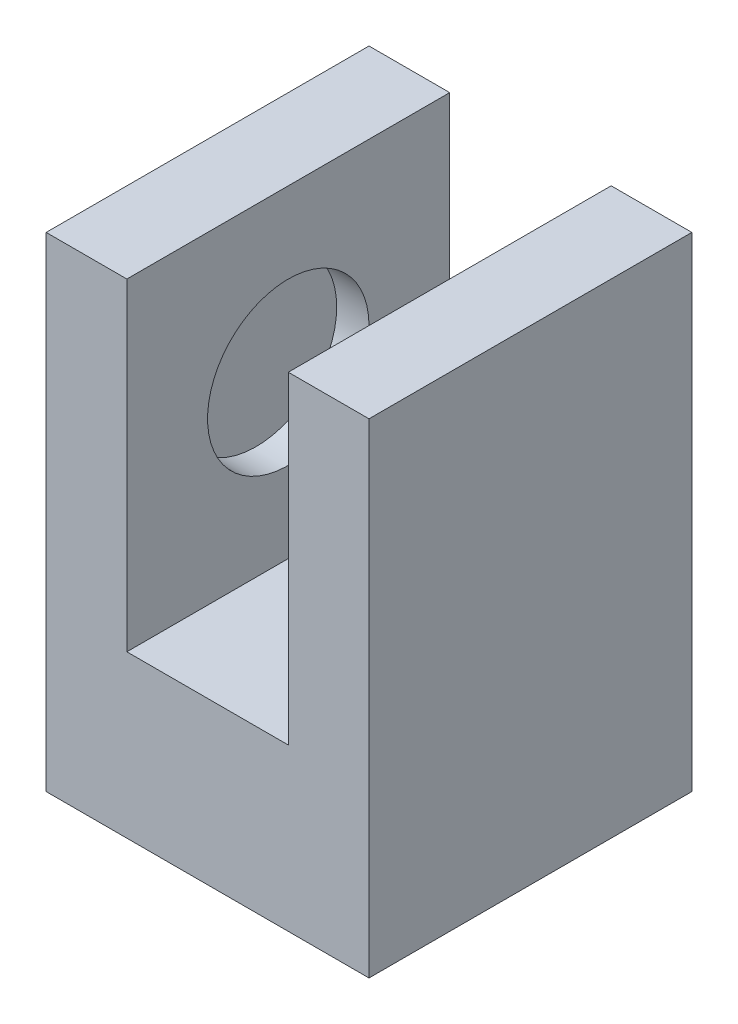
ISO-10303-21;
HEADER;
FILE_DESCRIPTION(('STEP AP214'),'2;1');
FILE_NAME('part.step','',(''),(''),'','','');
FILE_SCHEMA(('AUTOMOTIVE_DESIGN { 1 0 10303 214 1 1 1 1 }'));
ENDSEC;
DATA;
#1=APPLICATION_CONTEXT('core data for automotive mechanical design processes');
#2=APPLICATION_PROTOCOL_DEFINITION('international standard','automotive_design',2000,#1);
#3=PRODUCT_CONTEXT('',#1,'mechanical');
#4=PRODUCT('Part','Part','',(#3));
#5=PRODUCT_RELATED_PRODUCT_CATEGORY('part','',(#4));
#6=PRODUCT_DEFINITION_FORMATION('','',#4);
#7=PRODUCT_DEFINITION_CONTEXT('part definition',#1,'design');
#8=PRODUCT_DEFINITION('design','',#6,#7);
#9=PRODUCT_DEFINITION_SHAPE('','',#8);
#10=(LENGTH_UNIT() NAMED_UNIT(*) SI_UNIT(.MILLI.,.METRE.));
#11=(NAMED_UNIT(*) PLANE_ANGLE_UNIT() SI_UNIT($,.RADIAN.));
#12=(NAMED_UNIT(*) SI_UNIT($,.STERADIAN.) SOLID_ANGLE_UNIT());
#13=UNCERTAINTY_MEASURE_WITH_UNIT(LENGTH_MEASURE(1.E-05),#10,'distance_accuracy_value','');
#14=(GEOMETRIC_REPRESENTATION_CONTEXT(3) GLOBAL_UNCERTAINTY_ASSIGNED_CONTEXT((#13)) GLOBAL_UNIT_ASSIGNED_CONTEXT((#10,
#11,#12)) REPRESENTATION_CONTEXT('',''));
#15=CARTESIAN_POINT('',(0.,0.,0.));
#16=DIRECTION('',(0.,0.,1.));
#17=DIRECTION('',(1.,0.,0.));
#18=AXIS2_PLACEMENT_3D('',#15,#16,#17);
#19=CARTESIAN_POINT('',(0.,50.,0.));
#20=DIRECTION('',(0.,-1.,0.));
#21=DIRECTION('',(0.,0.,-1.));
#22=AXIS2_PLACEMENT_3D('',#19,#20,#21);
#23=PLANE('',#22);
#24=DIRECTION('',(-1.,0.,0.));
#25=VECTOR('',#24,1.);
#26=CARTESIAN_POINT('',(-50.,50.,-50.));
#27=LINE('',#26,#25);
#28=CARTESIAN_POINT('',(50.,50.,-50.));
#29=VERTEX_POINT('',#28);
#30=CARTESIAN_POINT('',(25.,50.,-50.));
#31=VERTEX_POINT('',#30);
#32=EDGE_CURVE('E139',#29,#31,#27,.T.);
#33=ORIENTED_EDGE('',*,*,#32,.T.);
#34=DIRECTION('',(0.,0.,-1.));
#35=VECTOR('',#34,1.);
#36=CARTESIAN_POINT('',(25.,50.,50.));
#37=LINE('',#36,#35);
#38=CARTESIAN_POINT('',(25.,50.,50.));
#39=VERTEX_POINT('',#38);
#40=EDGE_CURVE('E123',#39,#31,#37,.T.);
#41=ORIENTED_EDGE('',*,*,#40,.F.);
#42=DIRECTION('',(1.,0.,0.));
#43=VECTOR('',#42,1.);
#44=CARTESIAN_POINT('',(-50.,50.,50.));
#45=LINE('',#44,#43);
#46=CARTESIAN_POINT('',(50.,50.,50.));
#47=VERTEX_POINT('',#46);
#48=EDGE_CURVE('E145',#39,#47,#45,.T.);
#49=ORIENTED_EDGE('',*,*,#48,.T.);
#50=DIRECTION('',(0.,0.,-1.));
#51=VECTOR('',#50,1.);
#52=CARTESIAN_POINT('',(50.,50.,50.));
#53=LINE('',#52,#51);
#54=EDGE_CURVE('E135',#47,#29,#53,.T.);
#55=ORIENTED_EDGE('',*,*,#54,.T.);
#56=EDGE_LOOP('',(#33,#41,#49,#55));
#57=FACE_BOUND('',#56,.T.);
#58=ADVANCED_FACE('F41',(#57),#23,.F.);
#59=CARTESIAN_POINT('',(50.,-100.,50.));
#60=DIRECTION('',(1.,0.,0.));
#61=DIRECTION('',(0.,0.,-1.));
#62=AXIS2_PLACEMENT_3D('',#59,#60,#61);
#63=PLANE('',#62);
#64=DIRECTION('',(0.,1.,0.));
#65=VECTOR('',#64,1.);
#66=CARTESIAN_POINT('',(50.,-100.,-50.));
#67=LINE('',#66,#65);
#68=CARTESIAN_POINT('',(50.,-100.,-50.));
#69=VERTEX_POINT('',#68);
#70=EDGE_CURVE('E45',#69,#29,#67,.T.);
#71=ORIENTED_EDGE('',*,*,#70,.T.);
#72=ORIENTED_EDGE('',*,*,#54,.F.);
#73=DIRECTION('',(0.,1.,0.));
#74=VECTOR('',#73,1.);
#75=CARTESIAN_POINT('',(50.,-100.,50.));
#76=LINE('',#75,#74);
#77=CARTESIAN_POINT('',(50.,-100.,50.));
#78=VERTEX_POINT('',#77);
#79=EDGE_CURVE('E11',#78,#47,#76,.T.);
#80=ORIENTED_EDGE('',*,*,#79,.F.);
#81=DIRECTION('',(0.,0.,-1.));
#82=VECTOR('',#81,1.);
#83=CARTESIAN_POINT('',(50.,-100.,50.));
#84=LINE('',#83,#82);
#85=EDGE_CURVE('E149',#78,#69,#84,.T.);
#86=ORIENTED_EDGE('',*,*,#85,.T.);
#87=EDGE_LOOP('',(#71,#72,#80,#86));
#88=FACE_BOUND('',#87,.T.);
#89=ADVANCED_FACE('F43',(#88),#63,.T.);
#90=CARTESIAN_POINT('',(-50.,-100.,50.));
#91=DIRECTION('',(0.,0.,1.));
#92=DIRECTION('',(1.,0.,0.));
#93=AXIS2_PLACEMENT_3D('',#90,#91,#92);
#94=PLANE('',#93);
#95=DIRECTION('',(0.,1.,0.));
#96=VECTOR('',#95,1.);
#97=CARTESIAN_POINT('',(25.,-50.,50.));
#98=LINE('',#97,#96);
#99=CARTESIAN_POINT('',(25.,-50.,50.));
#100=VERTEX_POINT('',#99);
#101=EDGE_CURVE('E130',#100,#39,#98,.T.);
#102=ORIENTED_EDGE('',*,*,#101,.F.);
#103=DIRECTION('',(1.,0.,0.));
#104=VECTOR('',#103,1.);
#105=CARTESIAN_POINT('',(-25.,-50.,50.));
#106=LINE('',#105,#104);
#107=CARTESIAN_POINT('',(-25.,-50.,50.));
#108=VERTEX_POINT('',#107);
#109=EDGE_CURVE('E113',#108,#100,#106,.T.);
#110=ORIENTED_EDGE('',*,*,#109,.F.);
#111=DIRECTION('',(0.,1.,0.));
#112=VECTOR('',#111,1.);
#113=CARTESIAN_POINT('',(-25.,-50.,50.));
#114=LINE('',#113,#112);
#115=CARTESIAN_POINT('',(-25.,50.,50.));
#116=VERTEX_POINT('',#115);
#117=EDGE_CURVE('E110',#108,#116,#114,.T.);
#118=ORIENTED_EDGE('',*,*,#117,.T.);
#119=CARTESIAN_POINT('',(-50.,50.,50.));
#120=VERTEX_POINT('',#119);
#121=EDGE_CURVE('E146',#120,#116,#45,.T.);
#122=ORIENTED_EDGE('',*,*,#121,.F.);
#123=DIRECTION('',(0.,1.,0.));
#124=VECTOR('',#123,1.);
#125=CARTESIAN_POINT('',(-50.,-100.,50.));
#126=LINE('',#125,#124);
#127=CARTESIAN_POINT('',(-50.,-100.,50.));
#128=VERTEX_POINT('',#127);
#129=EDGE_CURVE('E50',#128,#120,#126,.T.);
#130=ORIENTED_EDGE('',*,*,#129,.F.);
#131=DIRECTION('',(1.,0.,0.));
#132=VECTOR('',#131,1.);
#133=CARTESIAN_POINT('',(-50.,-100.,50.));
#134=LINE('',#133,#132);
#135=EDGE_CURVE('E157',#128,#78,#134,.T.);
#136=ORIENTED_EDGE('',*,*,#135,.T.);
#137=ORIENTED_EDGE('',*,*,#79,.T.);
#138=ORIENTED_EDGE('',*,*,#48,.F.);
#139=EDGE_LOOP('',(#102,#110,#118,#122,#130,#136,#137,#138));
#140=FACE_BOUND('',#139,.T.);
#141=ADVANCED_FACE('F169',(#140),#94,.T.);
#142=CARTESIAN_POINT('',(-50.,-100.,50.));
#143=DIRECTION('',(-1.,0.,0.));
#144=DIRECTION('',(0.,0.,1.));
#145=AXIS2_PLACEMENT_3D('',#142,#143,#144);
#146=PLANE('',#145);
#147=ORIENTED_EDGE('',*,*,#129,.T.);
#148=DIRECTION('',(0.,0.,1.));
#149=VECTOR('',#148,1.);
#150=CARTESIAN_POINT('',(-50.,50.,50.));
#151=LINE('',#150,#149);
#152=CARTESIAN_POINT('',(-50.,50.,-50.));
#153=VERTEX_POINT('',#152);
#154=EDGE_CURVE('E142',#153,#120,#151,.T.);
#155=ORIENTED_EDGE('',*,*,#154,.F.);
#156=DIRECTION('',(0.,1.,0.));
#157=VECTOR('',#156,1.);
#158=CARTESIAN_POINT('',(-50.,-100.,-50.));
#159=LINE('',#158,#157);
#160=CARTESIAN_POINT('',(-50.,-100.,-50.));
#161=VERTEX_POINT('',#160);
#162=EDGE_CURVE('E160',#161,#153,#159,.T.);
#163=ORIENTED_EDGE('',*,*,#162,.F.);
#164=DIRECTION('',(0.,0.,1.));
#165=VECTOR('',#164,1.);
#166=CARTESIAN_POINT('',(-50.,-100.,50.));
#167=LINE('',#166,#165);
#168=EDGE_CURVE('E154',#161,#128,#167,.T.);
#169=ORIENTED_EDGE('',*,*,#168,.T.);
#170=EDGE_LOOP('',(#147,#155,#163,#169));
#171=FACE_BOUND('',#170,.T.);
#172=ADVANCED_FACE('F176',(#171),#146,.T.);
#173=CARTESIAN_POINT('',(-50.,-100.,-50.));
#174=DIRECTION('',(0.,0.,-1.));
#175=DIRECTION('',(-1.,0.,0.));
#176=AXIS2_PLACEMENT_3D('',#173,#174,#175);
#177=PLANE('',#176);
#178=DIRECTION('',(0.,1.,0.));
#179=VECTOR('',#178,1.);
#180=CARTESIAN_POINT('',(25.,-50.,-50.));
#181=LINE('',#180,#179);
#182=CARTESIAN_POINT('',(25.,-50.,-50.));
#183=VERTEX_POINT('',#182);
#184=EDGE_CURVE('E138',#183,#31,#181,.T.);
#185=ORIENTED_EDGE('',*,*,#184,.T.);
#186=ORIENTED_EDGE('',*,*,#32,.F.);
#187=ORIENTED_EDGE('',*,*,#70,.F.);
#188=DIRECTION('',(-1.,0.,0.));
#189=VECTOR('',#188,1.);
#190=CARTESIAN_POINT('',(-50.,-100.,-50.));
#191=LINE('',#190,#189);
#192=EDGE_CURVE('E151',#69,#161,#191,.T.);
#193=ORIENTED_EDGE('',*,*,#192,.T.);
#194=ORIENTED_EDGE('',*,*,#162,.T.);
#195=CARTESIAN_POINT('',(-25.,50.,-50.));
#196=VERTEX_POINT('',#195);
#197=EDGE_CURVE('E128',#196,#153,#27,.T.);
#198=ORIENTED_EDGE('',*,*,#197,.F.);
#199=DIRECTION('',(0.,1.,0.));
#200=VECTOR('',#199,1.);
#201=CARTESIAN_POINT('',(-25.,-50.,-50.));
#202=LINE('',#201,#200);
#203=CARTESIAN_POINT('',(-25.,-50.,-50.));
#204=VERTEX_POINT('',#203);
#205=EDGE_CURVE('E58',#204,#196,#202,.T.);
#206=ORIENTED_EDGE('',*,*,#205,.F.);
#207=DIRECTION('',(-1.,0.,0.));
#208=VECTOR('',#207,1.);
#209=CARTESIAN_POINT('',(25.,-50.,-50.));
#210=LINE('',#209,#208);
#211=EDGE_CURVE('E114',#183,#204,#210,.T.);
#212=ORIENTED_EDGE('',*,*,#211,.F.);
#213=EDGE_LOOP('',(#185,#186,#187,#193,#194,#198,#206,#212));
#214=FACE_BOUND('',#213,.T.);
#215=ADVANCED_FACE('F126',(#214),#177,.T.);
#216=CARTESIAN_POINT('',(0.,-100.,0.));
#217=DIRECTION('',(0.,-1.,0.));
#218=DIRECTION('',(0.,0.,-1.));
#219=AXIS2_PLACEMENT_3D('',#216,#217,#218);
#220=PLANE('',#219);
#221=ORIENTED_EDGE('',*,*,#85,.F.);
#222=ORIENTED_EDGE('',*,*,#135,.F.);
#223=ORIENTED_EDGE('',*,*,#168,.F.);
#224=ORIENTED_EDGE('',*,*,#192,.F.);
#225=EDGE_LOOP('',(#221,#222,#223,#224));
#226=FACE_BOUND('',#225,.T.);
#227=ADVANCED_FACE('F174',(#226),#220,.T.);
#228=ORIENTED_EDGE('',*,*,#121,.T.);
#229=DIRECTION('',(0.,0.,1.));
#230=VECTOR('',#229,1.);
#231=CARTESIAN_POINT('',(-25.,50.,-50.));
#232=LINE('',#231,#230);
#233=EDGE_CURVE('E181',#196,#116,#232,.T.);
#234=ORIENTED_EDGE('',*,*,#233,.F.);
#235=ORIENTED_EDGE('',*,*,#197,.T.);
#236=ORIENTED_EDGE('',*,*,#154,.T.);
#237=EDGE_LOOP('',(#228,#234,#235,#236));
#238=FACE_BOUND('',#237,.T.);
#239=ADVANCED_FACE('F178',(#238),#23,.F.);
#240=CARTESIAN_POINT('',(25.,-50.,50.));
#241=DIRECTION('',(1.,0.,0.));
#242=DIRECTION('',(0.,0.,-1.));
#243=AXIS2_PLACEMENT_3D('',#240,#241,#242);
#244=PLANE('',#243);
#245=CARTESIAN_POINT('',(25.,0.,0.));
#246=DIRECTION('',(-1.,0.,0.));
#247=DIRECTION('',(0.,0.,1.));
#248=AXIS2_PLACEMENT_3D('',#245,#246,#247);
#249=CIRCLE('',#248,25.);
#250=CARTESIAN_POINT('',(25.,0.,25.));
#251=VERTEX_POINT('',#250);
#252=EDGE_CURVE('E339',#251,#251,#249,.T.);
#253=ORIENTED_EDGE('',*,*,#252,.F.);
#254=EDGE_LOOP('',(#253));
#255=FACE_BOUND('',#254,.T.);
#256=ORIENTED_EDGE('',*,*,#40,.T.);
#257=ORIENTED_EDGE('',*,*,#184,.F.);
#258=DIRECTION('',(0.,0.,-1.));
#259=VECTOR('',#258,1.);
#260=CARTESIAN_POINT('',(25.,-50.,50.));
#261=LINE('',#260,#259);
#262=EDGE_CURVE('E120',#100,#183,#261,.T.);
#263=ORIENTED_EDGE('',*,*,#262,.F.);
#264=ORIENTED_EDGE('',*,*,#101,.T.);
#265=EDGE_LOOP('',(#256,#257,#263,#264));
#266=FACE_BOUND('',#265,.T.);
#267=ADVANCED_FACE('F186',(#255,#266),#244,.F.);
#268=CARTESIAN_POINT('',(-25.,-50.,-50.));
#269=DIRECTION('',(-1.,0.,0.));
#270=DIRECTION('',(0.,0.,1.));
#271=AXIS2_PLACEMENT_3D('',#268,#269,#270);
#272=PLANE('',#271);
#273=CARTESIAN_POINT('',(-25.,0.,0.));
#274=DIRECTION('',(1.,0.,0.));
#275=DIRECTION('',(0.,0.,-1.));
#276=AXIS2_PLACEMENT_3D('',#273,#274,#275);
#277=CIRCLE('',#276,25.);
#278=CARTESIAN_POINT('',(-25.,0.,-25.));
#279=VERTEX_POINT('',#278);
#280=EDGE_CURVE('E338',#279,#279,#277,.T.);
#281=ORIENTED_EDGE('',*,*,#280,.F.);
#282=EDGE_LOOP('',(#281));
#283=FACE_BOUND('',#282,.T.);
#284=ORIENTED_EDGE('',*,*,#233,.T.);
#285=ORIENTED_EDGE('',*,*,#117,.F.);
#286=DIRECTION('',(0.,0.,1.));
#287=VECTOR('',#286,1.);
#288=CARTESIAN_POINT('',(-25.,-50.,-50.));
#289=LINE('',#288,#287);
#290=EDGE_CURVE('E106',#204,#108,#289,.T.);
#291=ORIENTED_EDGE('',*,*,#290,.F.);
#292=ORIENTED_EDGE('',*,*,#205,.T.);
#293=EDGE_LOOP('',(#284,#285,#291,#292));
#294=FACE_BOUND('',#293,.T.);
#295=ADVANCED_FACE('F108',(#283,#294),#272,.F.);
#296=CARTESIAN_POINT('',(0.,-50.,0.));
#297=DIRECTION('',(0.,1.,0.));
#298=DIRECTION('',(0.,0.,1.));
#299=AXIS2_PLACEMENT_3D('',#296,#297,#298);
#300=PLANE('',#299);
#301=ORIENTED_EDGE('',*,*,#211,.T.);
#302=ORIENTED_EDGE('',*,*,#290,.T.);
#303=ORIENTED_EDGE('',*,*,#109,.T.);
#304=ORIENTED_EDGE('',*,*,#262,.T.);
#305=EDGE_LOOP('',(#301,#302,#303,#304));
#306=FACE_BOUND('',#305,.T.);
#307=ADVANCED_FACE('F118',(#306),#300,.T.);
#308=CARTESIAN_POINT('',(-35.,0.,0.));
#309=DIRECTION('',(1.,0.,0.));
#310=DIRECTION('',(0.,0.,-1.));
#311=AXIS2_PLACEMENT_3D('',#308,#309,#310);
#312=CYLINDRICAL_SURFACE('',#311,25.);
#313=CARTESIAN_POINT('',(-35.,0.,0.));
#314=DIRECTION('',(1.,0.,0.));
#315=DIRECTION('',(0.,0.,-1.));
#316=AXIS2_PLACEMENT_3D('',#313,#314,#315);
#317=CIRCLE('',#316,25.);
#318=CARTESIAN_POINT('',(-35.,0.,-25.));
#319=VERTEX_POINT('',#318);
#320=EDGE_CURVE('E183',#319,#319,#317,.T.);
#321=ORIENTED_EDGE('',*,*,#320,.F.);
#322=EDGE_LOOP('',(#321));
#323=FACE_BOUND('',#322,.T.);
#324=ORIENTED_EDGE('',*,*,#280,.T.);
#325=EDGE_LOOP('',(#324));
#326=FACE_BOUND('',#325,.T.);
#327=ADVANCED_FACE('F234',(#323,#326),#312,.F.);
#328=CARTESIAN_POINT('',(-35.,0.,0.));
#329=DIRECTION('',(1.,0.,0.));
#330=DIRECTION('',(0.,0.,-1.));
#331=AXIS2_PLACEMENT_3D('',#328,#329,#330);
#332=PLANE('',#331);
#333=ORIENTED_EDGE('',*,*,#320,.T.);
#334=EDGE_LOOP('',(#333));
#335=FACE_BOUND('',#334,.T.);
#336=ADVANCED_FACE('F251',(#335),#332,.T.);
#337=CARTESIAN_POINT('',(35.,0.,0.));
#338=DIRECTION('',(-1.,0.,0.));
#339=DIRECTION('',(0.,0.,1.));
#340=AXIS2_PLACEMENT_3D('',#337,#338,#339);
#341=CYLINDRICAL_SURFACE('',#340,25.);
#342=CARTESIAN_POINT('',(35.,0.,0.));
#343=DIRECTION('',(-1.,0.,0.));
#344=DIRECTION('',(0.,0.,1.));
#345=AXIS2_PLACEMENT_3D('',#342,#343,#344);
#346=CIRCLE('',#345,25.);
#347=CARTESIAN_POINT('',(35.,0.,25.));
#348=VERTEX_POINT('',#347);
#349=EDGE_CURVE('E337',#348,#348,#346,.T.);
#350=ORIENTED_EDGE('',*,*,#349,.F.);
#351=EDGE_LOOP('',(#350));
#352=FACE_BOUND('',#351,.T.);
#353=ORIENTED_EDGE('',*,*,#252,.T.);
#354=EDGE_LOOP('',(#353));
#355=FACE_BOUND('',#354,.T.);
#356=ADVANCED_FACE('F261',(#352,#355),#341,.F.);
#357=CARTESIAN_POINT('',(35.,0.,0.));
#358=DIRECTION('',(-1.,0.,0.));
#359=DIRECTION('',(0.,0.,1.));
#360=AXIS2_PLACEMENT_3D('',#357,#358,#359);
#361=PLANE('',#360);
#362=ORIENTED_EDGE('',*,*,#349,.T.);
#363=EDGE_LOOP('',(#362));
#364=FACE_BOUND('',#363,.T.);
#365=ADVANCED_FACE('F277',(#364),#361,.T.);
#366=CLOSED_SHELL('',(#58,#89,#141,#172,#215,#227,#239,#267,#295,#307,#327,#336,#356,#365));
#367=MANIFOLD_SOLID_BREP('B2',#366);
#368=ADVANCED_BREP_SHAPE_REPRESENTATION('',(#18,#367),#14);
#369=SHAPE_DEFINITION_REPRESENTATION(#9,#368);
ENDSEC;
END-ISO-10303-21;
